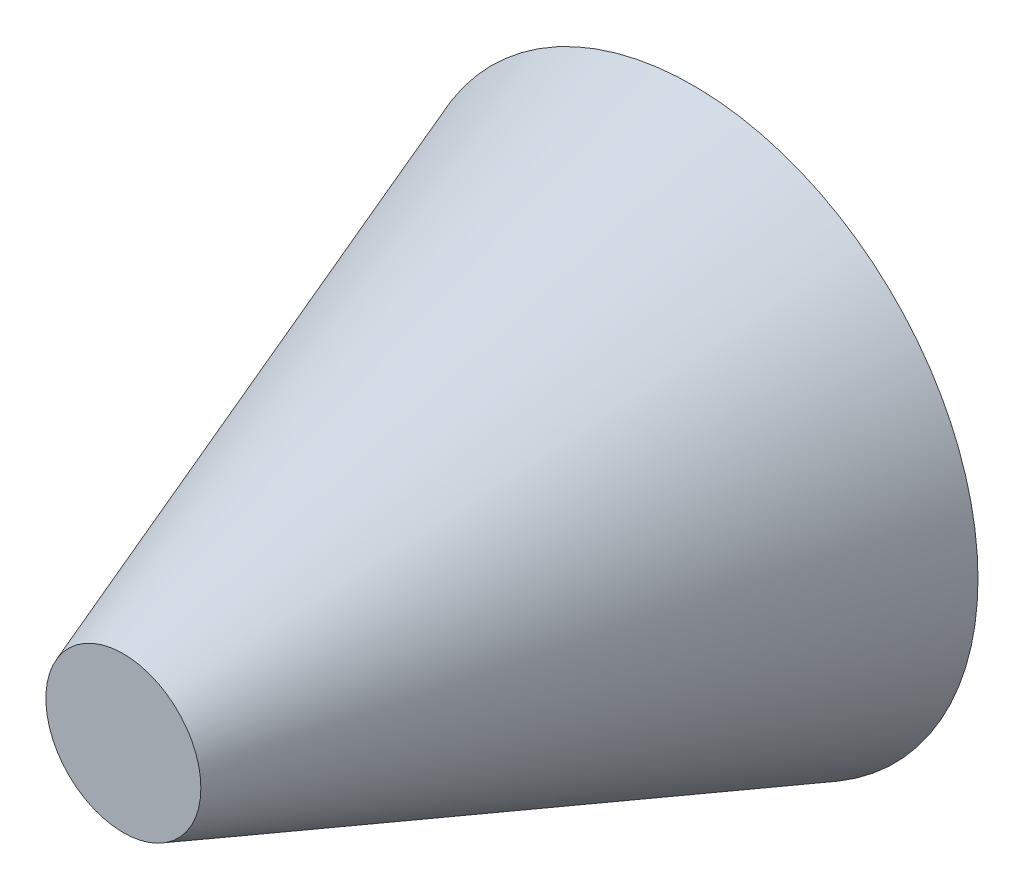
ISO-10303-21;
HEADER;
FILE_DESCRIPTION(('STEP AP214'),'2;1');
FILE_NAME('part.step','',(''),(''),'','','');
FILE_SCHEMA(('AUTOMOTIVE_DESIGN { 1 0 10303 214 1 1 1 1 }'));
ENDSEC;
DATA;
#1=APPLICATION_CONTEXT('core data for automotive mechanical design processes');
#2=APPLICATION_PROTOCOL_DEFINITION('international standard','automotive_design',2000,#1);
#3=PRODUCT_CONTEXT('',#1,'mechanical');
#4=PRODUCT('Part','Part','',(#3));
#5=PRODUCT_RELATED_PRODUCT_CATEGORY('part','',(#4));
#6=PRODUCT_DEFINITION_FORMATION('','',#4);
#7=PRODUCT_DEFINITION_CONTEXT('part definition',#1,'design');
#8=PRODUCT_DEFINITION('design','',#6,#7);
#9=PRODUCT_DEFINITION_SHAPE('','',#8);
#10=(LENGTH_UNIT() NAMED_UNIT(*) SI_UNIT(.MILLI.,.METRE.));
#11=(NAMED_UNIT(*) PLANE_ANGLE_UNIT() SI_UNIT($,.RADIAN.));
#12=(NAMED_UNIT(*) SI_UNIT($,.STERADIAN.) SOLID_ANGLE_UNIT());
#13=UNCERTAINTY_MEASURE_WITH_UNIT(LENGTH_MEASURE(1.E-05),#10,'distance_accuracy_value','');
#14=(GEOMETRIC_REPRESENTATION_CONTEXT(3) GLOBAL_UNCERTAINTY_ASSIGNED_CONTEXT((#13)) GLOBAL_UNIT_ASSIGNED_CONTEXT((#10,
#11,#12)) REPRESENTATION_CONTEXT('',''));
#15=CARTESIAN_POINT('',(0.,0.,0.));
#16=DIRECTION('',(0.,0.,1.));
#17=DIRECTION('',(1.,0.,0.));
#18=AXIS2_PLACEMENT_3D('',#15,#16,#17);
#19=CARTESIAN_POINT('',(0.,0.,0.));
#20=DIRECTION('',(0.,0.,-1.));
#21=DIRECTION('',(1.,0.,0.));
#22=AXIS2_PLACEMENT_3D('',#19,#20,#21);
#23=CONICAL_SURFACE('',#22,508.,0.349065850398867);
#24=CARTESIAN_POINT('',(0.,0.,1016.));
#25=DIRECTION('',(0.,0.,1.));
#26=DIRECTION('',(1.,0.,0.));
#27=AXIS2_PLACEMENT_3D('',#24,#25,#26);
#28=CIRCLE('',#27,138.206241985538);
#29=CARTESIAN_POINT('',(138.206241985538,0.,1016.));
#30=VERTEX_POINT('',#29);
#31=EDGE_CURVE('E10',#30,#30,#28,.T.);
#32=CARTESIAN_POINT('',(0.,0.,0.));
#33=DIRECTION('',(0.,0.,1.));
#34=DIRECTION('',(1.,0.,0.));
#35=AXIS2_PLACEMENT_3D('',#32,#33,#34);
#36=CIRCLE('',#35,508.);
#37=CARTESIAN_POINT('',(508.,0.,0.));
#38=VERTEX_POINT('',#37);
#39=EDGE_CURVE('E38',#38,#38,#36,.T.);
#40=CARTESIAN_POINT('',(138.206241985538,0.,1016.));
#41=CARTESIAN_POINT('',(142.058260298188,0.,1005.41666666667));
#42=CARTESIAN_POINT('',(145.910278610839,0.,994.833333333333));
#43=CARTESIAN_POINT('',(153.61431523614,0.,973.666666666667));
#44=CARTESIAN_POINT('',(157.466333548791,0.,963.083333333333));
#45=CARTESIAN_POINT('',(165.170370174092,0.,941.916666666667));
#46=CARTESIAN_POINT('',(169.022388486743,0.,931.333333333333));
#47=CARTESIAN_POINT('',(176.726425112044,0.,910.166666666667));
#48=CARTESIAN_POINT('',(180.578443424695,0.,899.583333333333));
#49=CARTESIAN_POINT('',(188.282480049996,0.,878.416666666667));
#50=CARTESIAN_POINT('',(192.134498362647,0.,867.833333333333));
#51=CARTESIAN_POINT('',(199.838534987948,0.,846.666666666667));
#52=CARTESIAN_POINT('',(203.690553300599,0.,836.083333333333));
#53=CARTESIAN_POINT('',(211.3945899259,0.,814.916666666667));
#54=CARTESIAN_POINT('',(215.246608238551,0.,804.333333333333));
#55=CARTESIAN_POINT('',(222.950644863852,0.,783.166666666667));
#56=CARTESIAN_POINT('',(226.802663176503,0.,772.583333333333));
#57=CARTESIAN_POINT('',(234.506699801804,0.,751.416666666667));
#58=CARTESIAN_POINT('',(238.358718114454,0.,740.833333333333));
#59=CARTESIAN_POINT('',(246.062754739756,0.,719.666666666667));
#60=CARTESIAN_POINT('',(249.914773052406,0.,709.083333333333));
#61=CARTESIAN_POINT('',(257.618809677708,0.,687.916666666667));
#62=CARTESIAN_POINT('',(261.470827990358,0.,677.333333333333));
#63=CARTESIAN_POINT('',(269.17486461566,0.,656.166666666667));
#64=CARTESIAN_POINT('',(273.02688292831,0.,645.583333333333));
#65=CARTESIAN_POINT('',(280.730919553612,0.,624.416666666667));
#66=CARTESIAN_POINT('',(284.582937866262,0.,613.833333333333));
#67=CARTESIAN_POINT('',(292.286974491564,0.,592.666666666667));
#68=CARTESIAN_POINT('',(296.138992804214,0.,582.083333333333));
#69=CARTESIAN_POINT('',(303.843029429516,0.,560.916666666667));
#70=CARTESIAN_POINT('',(307.695047742166,0.,550.333333333333));
#71=CARTESIAN_POINT('',(315.399084367467,0.,529.166666666667));
#72=CARTESIAN_POINT('',(319.251102680118,0.,518.583333333333));
#73=CARTESIAN_POINT('',(326.955139305419,0.,497.416666666667));
#74=CARTESIAN_POINT('',(330.80715761807,0.,486.833333333333));
#75=CARTESIAN_POINT('',(338.511194243371,0.,465.666666666667));
#76=CARTESIAN_POINT('',(342.363212556022,0.,455.083333333333));
#77=CARTESIAN_POINT('',(350.067249181323,0.,433.916666666667));
#78=CARTESIAN_POINT('',(353.919267493974,0.,423.333333333333));
#79=CARTESIAN_POINT('',(361.623304119275,0.,402.166666666667));
#80=CARTESIAN_POINT('',(365.475322431926,0.,391.583333333333));
#81=CARTESIAN_POINT('',(373.179359057227,0.,370.416666666667));
#82=CARTESIAN_POINT('',(377.031377369878,0.,359.833333333333));
#83=CARTESIAN_POINT('',(384.735413995179,0.,338.666666666667));
#84=CARTESIAN_POINT('',(388.58743230783,0.,328.083333333333));
#85=CARTESIAN_POINT('',(396.291468933131,0.,306.916666666667));
#86=CARTESIAN_POINT('',(400.143487245782,0.,296.333333333333));
#87=CARTESIAN_POINT('',(407.847523871083,0.,275.166666666667));
#88=CARTESIAN_POINT('',(411.699542183734,0.,264.583333333333));
#89=CARTESIAN_POINT('',(419.403578809035,0.,243.416666666667));
#90=CARTESIAN_POINT('',(423.255597121686,0.,232.833333333333));
#91=CARTESIAN_POINT('',(430.959633746987,0.,211.666666666667));
#92=CARTESIAN_POINT('',(434.811652059638,0.,201.083333333333));
#93=CARTESIAN_POINT('',(442.515688684939,0.,179.916666666667));
#94=CARTESIAN_POINT('',(446.36770699759,0.,169.333333333333));
#95=CARTESIAN_POINT('',(454.071743622891,0.,148.166666666667));
#96=CARTESIAN_POINT('',(457.923761935542,0.,137.583333333333));
#97=CARTESIAN_POINT('',(465.627798560843,0.,116.416666666667));
#98=CARTESIAN_POINT('',(469.479816873494,0.,105.833333333333));
#99=CARTESIAN_POINT('',(477.183853498795,0.,84.6666666666667));
#100=CARTESIAN_POINT('',(481.035871811445,0.,74.0833333333333));
#101=CARTESIAN_POINT('',(488.739908436747,0.,52.9166666666667));
#102=CARTESIAN_POINT('',(492.591926749397,0.,42.3333333333333));
#103=CARTESIAN_POINT('',(500.295963374699,0.,21.1666666666666));
#104=CARTESIAN_POINT('',(504.147981687349,0.,10.5833333333333));
#105=CARTESIAN_POINT('',(508.,0.,0.));
#106=B_SPLINE_CURVE_WITH_KNOTS('',3,(#40,#41,#42,#43,#44,#45,#46,#47,#48,#49,#50,#51,#52,#53,
#54,#55,#56,#57,#58,#59,#60,#61,#62,#63,#64,#65,#66,#67,#68,#69,#70,#71,#72,#73,#74,#75,#76,#77,
#78,#79,#80,#81,#82,#83,#84,#85,#86,#87,#88,#89,#90,#91,#92,#93,#94,#95,#96,#97,#98,#99,#100,
#101,#102,#103,#104,#105),.UNSPECIFIED.,.F.,.F.,(4,2,2,2,2,2,2,2,2,2,2,2,2,2,2,2,2,2,2,2,2,2,2,
2,2,2,2,2,2,2,2,2,4),(0.,33.7876442761102,67.5752885522204,101.362932828331,135.150577104441,
168.938221380551,202.725865656661,236.513509932772,270.301154208882,304.088798484992,
337.876442761102,371.664087037212,405.451731313323,439.239375589433,473.027019865543,
506.814664141653,540.602308417763,574.389952693874,608.177596969984,641.965241246094,
675.752885522204,709.540529798314,743.328174074425,777.115818350535,810.903462626645,
844.691106902755,878.478751178865,912.266395454976,946.054039731086,979.841684007196,
1013.62932828331,1047.41697255942,1081.20461683553),.UNSPECIFIED.);
#107=EDGE_CURVE('BSEAM32',#30,#38,#106,.T.);
#108=ORIENTED_EDGE('',*,*,#31,.F.);
#109=ORIENTED_EDGE('',*,*,#39,.T.);
#110=ORIENTED_EDGE('',*,*,#107,.T.);
#111=ORIENTED_EDGE('',*,*,#107,.F.);
#112=EDGE_LOOP('',(#108,#110,#109,#111));
#113=FACE_BOUND('',#112,.T.);
#114=ADVANCED_FACE('F32',(#113),#23,.T.);
#115=CARTESIAN_POINT('',(0.,0.,1016.));
#116=DIRECTION('',(0.,0.,1.));
#117=DIRECTION('',(1.,0.,0.));
#118=AXIS2_PLACEMENT_3D('',#115,#116,#117);
#119=PLANE('',#118);
#120=ORIENTED_EDGE('',*,*,#31,.T.);
#121=EDGE_LOOP('',(#120));
#122=FACE_BOUND('',#121,.T.);
#123=ADVANCED_FACE('F47',(#122),#119,.T.);
#124=CARTESIAN_POINT('',(0.,0.,0.));
#125=DIRECTION('',(0.,0.,1.));
#126=DIRECTION('',(1.,0.,0.));
#127=AXIS2_PLACEMENT_3D('',#124,#125,#126);
#128=PLANE('',#127);
#129=ORIENTED_EDGE('',*,*,#39,.F.);
#130=EDGE_LOOP('',(#129));
#131=FACE_BOUND('',#130,.T.);
#132=ADVANCED_FACE('F45',(#131),#128,.F.);
#133=CLOSED_SHELL('',(#114,#123,#132));
#134=MANIFOLD_SOLID_BREP('B2',#133);
#135=ADVANCED_BREP_SHAPE_REPRESENTATION('',(#18,#134),#14);
#136=SHAPE_DEFINITION_REPRESENTATION(#9,#135);
ENDSEC;
END-ISO-10303-21;
